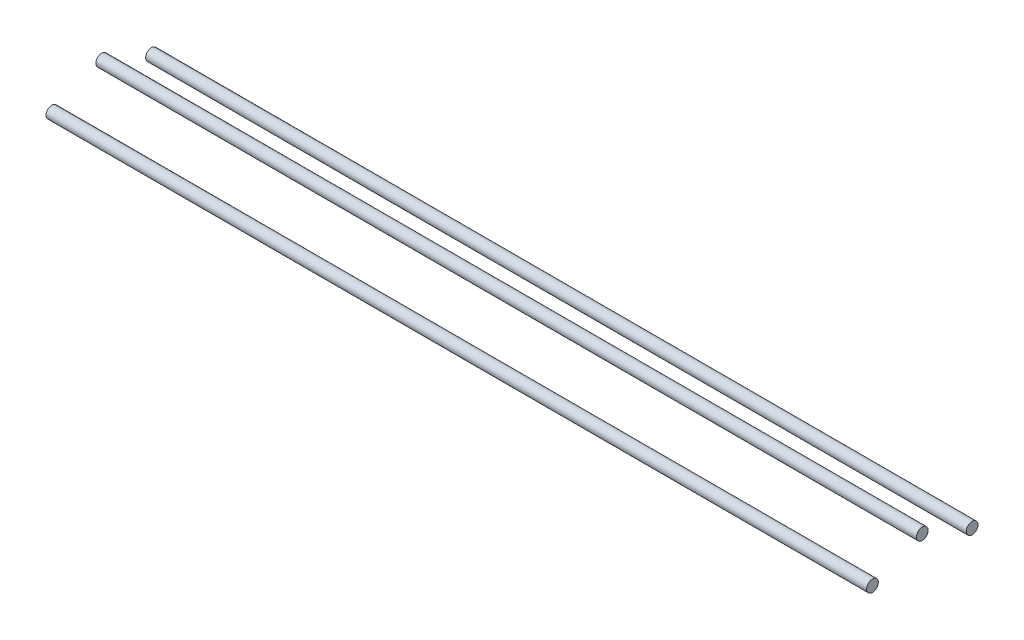
ISO-10303-21;
HEADER;
FILE_DESCRIPTION(('STEP AP214'),'2;1');
FILE_NAME('part.step','',(''),(''),'','','');
FILE_SCHEMA(('AUTOMOTIVE_DESIGN { 1 0 10303 214 1 1 1 1 }'));
ENDSEC;
DATA;
#1=APPLICATION_CONTEXT('core data for automotive mechanical design processes');
#2=APPLICATION_PROTOCOL_DEFINITION('international standard','automotive_design',2000,#1);
#3=PRODUCT_CONTEXT('',#1,'mechanical');
#4=PRODUCT('Part','Part','',(#3));
#5=PRODUCT_RELATED_PRODUCT_CATEGORY('part','',(#4));
#6=PRODUCT_DEFINITION_FORMATION('','',#4);
#7=PRODUCT_DEFINITION_CONTEXT('part definition',#1,'design');
#8=PRODUCT_DEFINITION('design','',#6,#7);
#9=PRODUCT_DEFINITION_SHAPE('','',#8);
#10=(LENGTH_UNIT() NAMED_UNIT(*) SI_UNIT(.MILLI.,.METRE.));
#11=(NAMED_UNIT(*) PLANE_ANGLE_UNIT() SI_UNIT($,.RADIAN.));
#12=(NAMED_UNIT(*) SI_UNIT($,.STERADIAN.) SOLID_ANGLE_UNIT());
#13=UNCERTAINTY_MEASURE_WITH_UNIT(LENGTH_MEASURE(1.E-05),#10,'distance_accuracy_value','');
#14=(GEOMETRIC_REPRESENTATION_CONTEXT(3) GLOBAL_UNCERTAINTY_ASSIGNED_CONTEXT((#13)) GLOBAL_UNIT_ASSIGNED_CONTEXT((#10,
#11,#12)) REPRESENTATION_CONTEXT('',''));
#15=CARTESIAN_POINT('',(0.,0.,0.));
#16=DIRECTION('',(0.,0.,1.));
#17=DIRECTION('',(1.,0.,0.));
#18=AXIS2_PLACEMENT_3D('',#15,#16,#17);
#19=CARTESIAN_POINT('',(-409.999999999998,0.,25.5));
#20=DIRECTION('',(1.,0.,0.));
#21=DIRECTION('',(0.,0.,-1.));
#22=AXIS2_PLACEMENT_3D('',#19,#20,#21);
#23=CYLINDRICAL_SURFACE('',#22,3.);
#24=CARTESIAN_POINT('',(-409.999999999998,0.,25.5));
#25=DIRECTION('',(1.,0.,0.));
#26=DIRECTION('',(0.,0.,-1.));
#27=AXIS2_PLACEMENT_3D('',#24,#25,#26);
#28=CIRCLE('',#27,3.);
#29=CARTESIAN_POINT('',(-409.999999999998,0.,22.5));
#30=VERTEX_POINT('',#29);
#31=EDGE_CURVE('E48',#30,#30,#28,.T.);
#32=ORIENTED_EDGE('',*,*,#31,.T.);
#33=EDGE_LOOP('',(#32));
#34=FACE_BOUND('',#33,.T.);
#35=CARTESIAN_POINT('',(10.,0.,25.5));
#36=DIRECTION('',(1.,0.,0.));
#37=DIRECTION('',(0.,0.,-1.));
#38=AXIS2_PLACEMENT_3D('',#35,#36,#37);
#39=CIRCLE('',#38,3.);
#40=CARTESIAN_POINT('',(10.,0.,22.5));
#41=VERTEX_POINT('',#40);
#42=EDGE_CURVE('E11',#41,#41,#39,.T.);
#43=ORIENTED_EDGE('',*,*,#42,.F.);
#44=EDGE_LOOP('',(#43));
#45=FACE_BOUND('',#44,.T.);
#46=ADVANCED_FACE('F44',(#34,#45),#23,.T.);
#47=CARTESIAN_POINT('',(-409.999999999998,0.,25.5));
#48=DIRECTION('',(1.,0.,0.));
#49=DIRECTION('',(0.,0.,-1.));
#50=AXIS2_PLACEMENT_3D('',#47,#48,#49);
#51=PLANE('',#50);
#52=ORIENTED_EDGE('',*,*,#31,.F.);
#53=EDGE_LOOP('',(#52));
#54=FACE_BOUND('',#53,.T.);
#55=ADVANCED_FACE('F46',(#54),#51,.F.);
#56=CARTESIAN_POINT('',(10.,0.,25.5));
#57=DIRECTION('',(1.,0.,0.));
#58=DIRECTION('',(0.,0.,-1.));
#59=AXIS2_PLACEMENT_3D('',#56,#57,#58);
#60=PLANE('',#59);
#61=ORIENTED_EDGE('',*,*,#42,.T.);
#62=EDGE_LOOP('',(#61));
#63=FACE_BOUND('',#62,.T.);
#64=ADVANCED_FACE('F60',(#63),#60,.T.);
#65=CLOSED_SHELL('',(#46,#55,#64));
#66=MANIFOLD_SOLID_BREP('B2',#65);
#67=CARTESIAN_POINT('',(-409.999999999998,10.2671901224164,0.));
#68=DIRECTION('',(1.,0.,0.));
#69=DIRECTION('',(0.,0.,-1.));
#70=AXIS2_PLACEMENT_3D('',#67,#68,#69);
#71=CYLINDRICAL_SURFACE('',#70,3.00000000000001);
#72=CARTESIAN_POINT('',(-409.999999999998,10.2671901224164,0.));
#73=DIRECTION('',(1.,0.,0.));
#74=DIRECTION('',(0.,0.,-1.));
#75=AXIS2_PLACEMENT_3D('',#72,#73,#74);
#76=CIRCLE('',#75,3.00000000000001);
#77=CARTESIAN_POINT('',(-409.999999999998,10.2671901224164,-3.00000000000001));
#78=VERTEX_POINT('',#77);
#79=EDGE_CURVE('E102',#78,#78,#76,.T.);
#80=ORIENTED_EDGE('',*,*,#79,.T.);
#81=EDGE_LOOP('',(#80));
#82=FACE_BOUND('',#81,.T.);
#83=CARTESIAN_POINT('',(10.,10.2671901224164,0.));
#84=DIRECTION('',(1.,0.,0.));
#85=DIRECTION('',(0.,0.,-1.));
#86=AXIS2_PLACEMENT_3D('',#83,#84,#85);
#87=CIRCLE('',#86,3.00000000000001);
#88=CARTESIAN_POINT('',(10.,10.2671901224164,-3.00000000000001));
#89=VERTEX_POINT('',#88);
#90=EDGE_CURVE('E43',#89,#89,#87,.T.);
#91=ORIENTED_EDGE('',*,*,#90,.F.);
#92=EDGE_LOOP('',(#91));
#93=FACE_BOUND('',#92,.T.);
#94=ADVANCED_FACE('F98',(#82,#93),#71,.T.);
#95=CARTESIAN_POINT('',(-409.999999999998,10.2671901224164,0.));
#96=DIRECTION('',(1.,0.,0.));
#97=DIRECTION('',(0.,0.,-1.));
#98=AXIS2_PLACEMENT_3D('',#95,#96,#97);
#99=PLANE('',#98);
#100=ORIENTED_EDGE('',*,*,#79,.F.);
#101=EDGE_LOOP('',(#100));
#102=FACE_BOUND('',#101,.T.);
#103=ADVANCED_FACE('F100',(#102),#99,.F.);
#104=CARTESIAN_POINT('',(10.,10.2671901224164,0.));
#105=DIRECTION('',(1.,0.,0.));
#106=DIRECTION('',(0.,0.,-1.));
#107=AXIS2_PLACEMENT_3D('',#104,#105,#106);
#108=PLANE('',#107);
#109=ORIENTED_EDGE('',*,*,#90,.T.);
#110=EDGE_LOOP('',(#109));
#111=FACE_BOUND('',#110,.T.);
#112=ADVANCED_FACE('F114',(#111),#108,.T.);
#113=CLOSED_SHELL('',(#94,#103,#112));
#114=MANIFOLD_SOLID_BREP('B6',#113);
#115=CARTESIAN_POINT('',(-409.999999999998,0.,-25.5));
#116=DIRECTION('',(1.,0.,0.));
#117=DIRECTION('',(0.,0.,-1.));
#118=AXIS2_PLACEMENT_3D('',#115,#116,#117);
#119=CYLINDRICAL_SURFACE('',#118,3.);
#120=CARTESIAN_POINT('',(-409.999999999998,0.,-25.5));
#121=DIRECTION('',(1.,0.,0.));
#122=DIRECTION('',(0.,0.,-1.));
#123=AXIS2_PLACEMENT_3D('',#120,#121,#122);
#124=CIRCLE('',#123,3.);
#125=CARTESIAN_POINT('',(-409.999999999998,0.,-28.5));
#126=VERTEX_POINT('',#125);
#127=EDGE_CURVE('E97',#126,#126,#124,.T.);
#128=ORIENTED_EDGE('',*,*,#127,.T.);
#129=EDGE_LOOP('',(#128));
#130=FACE_BOUND('',#129,.T.);
#131=CARTESIAN_POINT('',(10.,0.,-25.5));
#132=DIRECTION('',(1.,0.,0.));
#133=DIRECTION('',(0.,0.,-1.));
#134=AXIS2_PLACEMENT_3D('',#131,#132,#133);
#135=CIRCLE('',#134,3.);
#136=CARTESIAN_POINT('',(10.,0.,-28.5));
#137=VERTEX_POINT('',#136);
#138=EDGE_CURVE('E148',#137,#137,#135,.T.);
#139=ORIENTED_EDGE('',*,*,#138,.F.);
#140=EDGE_LOOP('',(#139));
#141=FACE_BOUND('',#140,.T.);
#142=ADVANCED_FACE('F145',(#130,#141),#119,.T.);
#143=CARTESIAN_POINT('',(-409.999999999998,0.,-25.5));
#144=DIRECTION('',(1.,0.,0.));
#145=DIRECTION('',(0.,0.,-1.));
#146=AXIS2_PLACEMENT_3D('',#143,#144,#145);
#147=PLANE('',#146);
#148=ORIENTED_EDGE('',*,*,#127,.F.);
#149=EDGE_LOOP('',(#148));
#150=FACE_BOUND('',#149,.T.);
#151=ADVANCED_FACE('F160',(#150),#147,.F.);
#152=CARTESIAN_POINT('',(10.,0.,-25.5));
#153=DIRECTION('',(1.,0.,0.));
#154=DIRECTION('',(0.,0.,-1.));
#155=AXIS2_PLACEMENT_3D('',#152,#153,#154);
#156=PLANE('',#155);
#157=ORIENTED_EDGE('',*,*,#138,.T.);
#158=EDGE_LOOP('',(#157));
#159=FACE_BOUND('',#158,.T.);
#160=ADVANCED_FACE('F157',(#159),#156,.T.);
#161=CLOSED_SHELL('',(#142,#151,#160));
#162=MANIFOLD_SOLID_BREP('B38',#161);
#163=ADVANCED_BREP_SHAPE_REPRESENTATION('',(#18,#66,#114,#162),#14);
#164=SHAPE_DEFINITION_REPRESENTATION(#9,#163);
ENDSEC;
END-ISO-10303-21;
